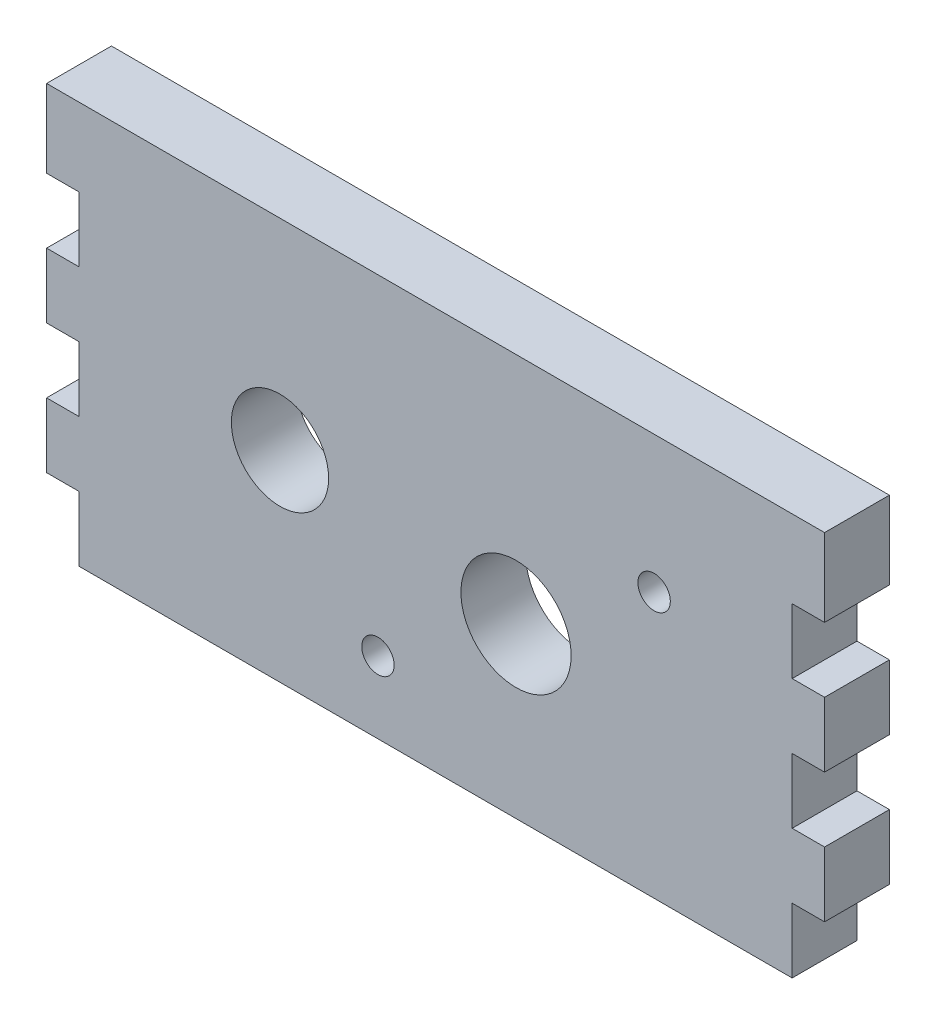
ISO-10303-21;
HEADER;
FILE_DESCRIPTION(('STEP AP214'),'2;1');
FILE_NAME('part.step','',(''),(''),'','','');
FILE_SCHEMA(('AUTOMOTIVE_DESIGN { 1 0 10303 214 1 1 1 1 }'));
ENDSEC;
DATA;
#1=APPLICATION_CONTEXT('core data for automotive mechanical design processes');
#2=APPLICATION_PROTOCOL_DEFINITION('international standard','automotive_design',2000,#1);
#3=PRODUCT_CONTEXT('',#1,'mechanical');
#4=PRODUCT('Part','Part','',(#3));
#5=PRODUCT_RELATED_PRODUCT_CATEGORY('part','',(#4));
#6=PRODUCT_DEFINITION_FORMATION('','',#4);
#7=PRODUCT_DEFINITION_CONTEXT('part definition',#1,'design');
#8=PRODUCT_DEFINITION('design','',#6,#7);
#9=PRODUCT_DEFINITION_SHAPE('','',#8);
#10=(LENGTH_UNIT() NAMED_UNIT(*) SI_UNIT(.MILLI.,.METRE.));
#11=(NAMED_UNIT(*) PLANE_ANGLE_UNIT() SI_UNIT($,.RADIAN.));
#12=(NAMED_UNIT(*) SI_UNIT($,.STERADIAN.) SOLID_ANGLE_UNIT());
#13=UNCERTAINTY_MEASURE_WITH_UNIT(LENGTH_MEASURE(1.E-05),#10,'distance_accuracy_value','');
#14=(GEOMETRIC_REPRESENTATION_CONTEXT(3) GLOBAL_UNCERTAINTY_ASSIGNED_CONTEXT((#13)) GLOBAL_UNIT_ASSIGNED_CONTEXT((#10,
#11,#12)) REPRESENTATION_CONTEXT('',''));
#15=CARTESIAN_POINT('',(0.,0.,0.));
#16=DIRECTION('',(0.,0.,1.));
#17=DIRECTION('',(1.,0.,0.));
#18=AXIS2_PLACEMENT_3D('',#15,#16,#17);
#19=CARTESIAN_POINT('',(0.,-31.,10.));
#20=DIRECTION('',(0.,1.,0.));
#21=DIRECTION('',(0.,0.,1.));
#22=AXIS2_PLACEMENT_3D('',#19,#20,#21);
#23=PLANE('',#22);
#24=DIRECTION('',(0.,0.,1.));
#25=VECTOR('',#24,1.);
#26=CARTESIAN_POINT('',(55.,-31.,-0.000999999999999265));
#27=LINE('',#26,#25);
#28=CARTESIAN_POINT('',(55.,-31.,0.));
#29=VERTEX_POINT('',#28);
#30=CARTESIAN_POINT('',(55.,-31.,10.));
#31=VERTEX_POINT('',#30);
#32=EDGE_CURVE('E205',#29,#31,#27,.T.);
#33=ORIENTED_EDGE('',*,*,#32,.T.);
#34=DIRECTION('',(1.,0.,0.));
#35=VECTOR('',#34,1.);
#36=CARTESIAN_POINT('',(0.,-31.,10.));
#37=LINE('',#36,#35);
#38=CARTESIAN_POINT('',(-55.,-31.,10.));
#39=VERTEX_POINT('',#38);
#40=EDGE_CURVE('E265',#39,#31,#37,.T.);
#41=ORIENTED_EDGE('',*,*,#40,.F.);
#42=DIRECTION('',(0.,0.,1.));
#43=VECTOR('',#42,1.);
#44=CARTESIAN_POINT('',(-55.,-31.,-0.000999999999999265));
#45=LINE('',#44,#43);
#46=CARTESIAN_POINT('',(-55.,-31.,0.));
#47=VERTEX_POINT('',#46);
#48=EDGE_CURVE('E281',#47,#39,#45,.T.);
#49=ORIENTED_EDGE('',*,*,#48,.F.);
#50=DIRECTION('',(1.,0.,0.));
#51=VECTOR('',#50,1.);
#52=CARTESIAN_POINT('',(0.,-31.,0.));
#53=LINE('',#52,#51);
#54=EDGE_CURVE('E230',#47,#29,#53,.T.);
#55=ORIENTED_EDGE('',*,*,#54,.T.);
#56=EDGE_LOOP('',(#33,#41,#49,#55));
#57=FACE_BOUND('',#56,.T.);
#58=ADVANCED_FACE('F37',(#57),#23,.F.);
#59=CARTESIAN_POINT('',(60.,0.,10.));
#60=DIRECTION('',(-1.,0.,0.));
#61=DIRECTION('',(0.,0.,1.));
#62=AXIS2_PLACEMENT_3D('',#59,#60,#61);
#63=PLANE('',#62);
#64=DIRECTION('',(0.,0.,1.));
#65=VECTOR('',#64,1.);
#66=CARTESIAN_POINT('',(60.,-21.,-0.000999999999999265));
#67=LINE('',#66,#65);
#68=CARTESIAN_POINT('',(60.,-21.,0.));
#69=VERTEX_POINT('',#68);
#70=CARTESIAN_POINT('',(60.,-21.,10.));
#71=VERTEX_POINT('',#70);
#72=EDGE_CURVE('E199',#69,#71,#67,.T.);
#73=ORIENTED_EDGE('',*,*,#72,.F.);
#74=DIRECTION('',(0.,1.,0.));
#75=VECTOR('',#74,1.);
#76=CARTESIAN_POINT('',(60.,0.,0.));
#77=LINE('',#76,#75);
#78=CARTESIAN_POINT('',(60.,-11.,0.));
#79=VERTEX_POINT('',#78);
#80=EDGE_CURVE('E212',#69,#79,#77,.T.);
#81=ORIENTED_EDGE('',*,*,#80,.T.);
#82=DIRECTION('',(0.,0.,1.));
#83=VECTOR('',#82,1.);
#84=CARTESIAN_POINT('',(60.,-11.,-0.000999999999999265));
#85=LINE('',#84,#83);
#86=CARTESIAN_POINT('',(60.,-11.,10.));
#87=VERTEX_POINT('',#86);
#88=EDGE_CURVE('E375',#79,#87,#85,.T.);
#89=ORIENTED_EDGE('',*,*,#88,.T.);
#90=DIRECTION('',(0.,1.,0.));
#91=VECTOR('',#90,1.);
#92=CARTESIAN_POINT('',(60.,0.,10.));
#93=LINE('',#92,#91);
#94=EDGE_CURVE('E214',#71,#87,#93,.T.);
#95=ORIENTED_EDGE('',*,*,#94,.F.);
#96=EDGE_LOOP('',(#73,#81,#89,#95));
#97=FACE_BOUND('',#96,.T.);
#98=ADVANCED_FACE('F210',(#97),#63,.F.);
#99=DIRECTION('',(0.,0.,1.));
#100=VECTOR('',#99,1.);
#101=CARTESIAN_POINT('',(60.,-1.,-0.000999999999999265));
#102=LINE('',#101,#100);
#103=CARTESIAN_POINT('',(60.,-1.,0.));
#104=VERTEX_POINT('',#103);
#105=CARTESIAN_POINT('',(60.,-1.,10.));
#106=VERTEX_POINT('',#105);
#107=EDGE_CURVE('E376',#104,#106,#102,.T.);
#108=ORIENTED_EDGE('',*,*,#107,.F.);
#109=CARTESIAN_POINT('',(60.,8.99999999999999,0.));
#110=VERTEX_POINT('',#109);
#111=EDGE_CURVE('E222',#104,#110,#77,.T.);
#112=ORIENTED_EDGE('',*,*,#111,.T.);
#113=DIRECTION('',(0.,0.,1.));
#114=VECTOR('',#113,1.);
#115=CARTESIAN_POINT('',(60.,8.99999999999999,-0.000999999999999265));
#116=LINE('',#115,#114);
#117=CARTESIAN_POINT('',(60.,8.99999999999999,10.));
#118=VERTEX_POINT('',#117);
#119=EDGE_CURVE('E347',#110,#118,#116,.T.);
#120=ORIENTED_EDGE('',*,*,#119,.T.);
#121=EDGE_CURVE('E264',#106,#118,#93,.T.);
#122=ORIENTED_EDGE('',*,*,#121,.F.);
#123=EDGE_LOOP('',(#108,#112,#120,#122));
#124=FACE_BOUND('',#123,.T.);
#125=ADVANCED_FACE('F451',(#124),#63,.F.);
#126=DIRECTION('',(0.,0.,1.));
#127=VECTOR('',#126,1.);
#128=CARTESIAN_POINT('',(60.,19.,-0.000999999999999265));
#129=LINE('',#128,#127);
#130=CARTESIAN_POINT('',(60.,19.,0.));
#131=VERTEX_POINT('',#130);
#132=CARTESIAN_POINT('',(60.,19.,10.));
#133=VERTEX_POINT('',#132);
#134=EDGE_CURVE('E348',#131,#133,#129,.T.);
#135=ORIENTED_EDGE('',*,*,#134,.F.);
#136=CARTESIAN_POINT('',(60.,31.,0.));
#137=VERTEX_POINT('',#136);
#138=EDGE_CURVE('E224',#131,#137,#77,.T.);
#139=ORIENTED_EDGE('',*,*,#138,.T.);
#140=DIRECTION('',(0.,0.,-1.));
#141=VECTOR('',#140,1.);
#142=CARTESIAN_POINT('',(60.,31.,10.));
#143=LINE('',#142,#141);
#144=CARTESIAN_POINT('',(60.,31.,10.));
#145=VERTEX_POINT('',#144);
#146=EDGE_CURVE('E11',#145,#137,#143,.T.);
#147=ORIENTED_EDGE('',*,*,#146,.F.);
#148=EDGE_CURVE('E262',#133,#145,#93,.T.);
#149=ORIENTED_EDGE('',*,*,#148,.F.);
#150=EDGE_LOOP('',(#135,#139,#147,#149));
#151=FACE_BOUND('',#150,.T.);
#152=ADVANCED_FACE('F435',(#151),#63,.F.);
#153=CARTESIAN_POINT('',(0.,0.,10.));
#154=DIRECTION('',(0.,0.,1.));
#155=DIRECTION('',(1.,0.,0.));
#156=AXIS2_PLACEMENT_3D('',#153,#154,#155);
#157=PLANE('',#156);
#158=CARTESIAN_POINT('',(-8.88967796851376,-19.9129873451272,10.));
#159=DIRECTION('',(0.,0.,1.));
#160=DIRECTION('',(1.,0.,0.));
#161=AXIS2_PLACEMENT_3D('',#158,#159,#160);
#162=CIRCLE('',#161,2.5);
#163=CARTESIAN_POINT('',(-6.38967796851376,-19.9129873451272,10.));
#164=VERTEX_POINT('',#163);
#165=EDGE_CURVE('E277',#164,#164,#162,.T.);
#166=ORIENTED_EDGE('',*,*,#165,.F.);
#167=EDGE_LOOP('',(#166));
#168=FACE_BOUND('',#167,.T.);
#169=CARTESIAN_POINT('',(33.7062283345138,9.91298734512723,10.));
#170=DIRECTION('',(0.,0.,1.));
#171=DIRECTION('',(1.,0.,0.));
#172=AXIS2_PLACEMENT_3D('',#169,#170,#171);
#173=CIRCLE('',#172,2.5);
#174=CARTESIAN_POINT('',(36.2062283345138,9.91298734512723,10.));
#175=VERTEX_POINT('',#174);
#176=EDGE_CURVE('E274',#175,#175,#173,.T.);
#177=ORIENTED_EDGE('',*,*,#176,.F.);
#178=EDGE_LOOP('',(#177));
#179=FACE_BOUND('',#178,.T.);
#180=CARTESIAN_POINT('',(-24.,0.,10.));
#181=DIRECTION('',(0.,0.,1.));
#182=DIRECTION('',(1.,0.,0.));
#183=AXIS2_PLACEMENT_3D('',#180,#181,#182);
#184=CIRCLE('',#183,7.5);
#185=CARTESIAN_POINT('',(-16.5,0.,10.));
#186=VERTEX_POINT('',#185);
#187=EDGE_CURVE('E271',#186,#186,#184,.T.);
#188=ORIENTED_EDGE('',*,*,#187,.F.);
#189=EDGE_LOOP('',(#188));
#190=FACE_BOUND('',#189,.T.);
#191=CARTESIAN_POINT('',(12.408275183,-5.,10.));
#192=DIRECTION('',(0.,0.,1.));
#193=DIRECTION('',(1.,0.,0.));
#194=AXIS2_PLACEMENT_3D('',#191,#192,#193);
#195=CIRCLE('',#194,8.5);
#196=CARTESIAN_POINT('',(20.908275183,-5.,10.));
#197=VERTEX_POINT('',#196);
#198=EDGE_CURVE('E268',#197,#197,#195,.T.);
#199=ORIENTED_EDGE('',*,*,#198,.F.);
#200=EDGE_LOOP('',(#199));
#201=FACE_BOUND('',#200,.T.);
#202=ORIENTED_EDGE('',*,*,#40,.T.);
#203=DIRECTION('',(0.,1.,0.));
#204=VECTOR('',#203,1.);
#205=CARTESIAN_POINT('',(55.,-21.,10.));
#206=LINE('',#205,#204);
#207=CARTESIAN_POINT('',(55.,-21.,10.));
#208=VERTEX_POINT('',#207);
#209=EDGE_CURVE('E215',#31,#208,#206,.T.);
#210=ORIENTED_EDGE('',*,*,#209,.T.);
#211=DIRECTION('',(1.,0.,0.));
#212=VECTOR('',#211,1.);
#213=CARTESIAN_POINT('',(60.,-21.,10.));
#214=LINE('',#213,#212);
#215=EDGE_CURVE('E397',#208,#71,#214,.T.);
#216=ORIENTED_EDGE('',*,*,#215,.T.);
#217=ORIENTED_EDGE('',*,*,#94,.T.);
#218=DIRECTION('',(-1.,0.,0.));
#219=VECTOR('',#218,1.);
#220=CARTESIAN_POINT('',(60.,-11.,10.));
#221=LINE('',#220,#219);
#222=CARTESIAN_POINT('',(55.,-11.,10.));
#223=VERTEX_POINT('',#222);
#224=EDGE_CURVE('E378',#87,#223,#221,.T.);
#225=ORIENTED_EDGE('',*,*,#224,.T.);
#226=DIRECTION('',(0.,1.,0.));
#227=VECTOR('',#226,1.);
#228=CARTESIAN_POINT('',(55.,-1.,10.));
#229=LINE('',#228,#227);
#230=CARTESIAN_POINT('',(55.,-1.,10.));
#231=VERTEX_POINT('',#230);
#232=EDGE_CURVE('E385',#223,#231,#229,.T.);
#233=ORIENTED_EDGE('',*,*,#232,.T.);
#234=DIRECTION('',(1.,0.,0.));
#235=VECTOR('',#234,1.);
#236=CARTESIAN_POINT('',(60.,-1.,10.));
#237=LINE('',#236,#235);
#238=EDGE_CURVE('E388',#231,#106,#237,.T.);
#239=ORIENTED_EDGE('',*,*,#238,.T.);
#240=ORIENTED_EDGE('',*,*,#121,.T.);
#241=DIRECTION('',(-1.,0.,0.));
#242=VECTOR('',#241,1.);
#243=CARTESIAN_POINT('',(60.,8.99999999999999,10.));
#244=LINE('',#243,#242);
#245=CARTESIAN_POINT('',(55.,8.99999999999999,10.));
#246=VERTEX_POINT('',#245);
#247=EDGE_CURVE('E351',#118,#246,#244,.T.);
#248=ORIENTED_EDGE('',*,*,#247,.T.);
#249=DIRECTION('',(0.,1.,0.));
#250=VECTOR('',#249,1.);
#251=CARTESIAN_POINT('',(55.,19.,10.));
#252=LINE('',#251,#250);
#253=CARTESIAN_POINT('',(55.,19.,10.));
#254=VERTEX_POINT('',#253);
#255=EDGE_CURVE('E359',#246,#254,#252,.T.);
#256=ORIENTED_EDGE('',*,*,#255,.T.);
#257=DIRECTION('',(1.,0.,0.));
#258=VECTOR('',#257,1.);
#259=CARTESIAN_POINT('',(60.,19.,10.));
#260=LINE('',#259,#258);
#261=EDGE_CURVE('E362',#254,#133,#260,.T.);
#262=ORIENTED_EDGE('',*,*,#261,.T.);
#263=ORIENTED_EDGE('',*,*,#148,.T.);
#264=DIRECTION('',(1.,0.,0.));
#265=VECTOR('',#264,1.);
#266=CARTESIAN_POINT('',(0.,31.,10.));
#267=LINE('',#266,#265);
#268=CARTESIAN_POINT('',(-60.,31.,10.));
#269=VERTEX_POINT('',#268);
#270=EDGE_CURVE('E259',#269,#145,#267,.T.);
#271=ORIENTED_EDGE('',*,*,#270,.F.);
#272=DIRECTION('',(0.,1.,0.));
#273=VECTOR('',#272,1.);
#274=CARTESIAN_POINT('',(-60.,0.,10.));
#275=LINE('',#274,#273);
#276=CARTESIAN_POINT('',(-60.,19.,10.));
#277=VERTEX_POINT('',#276);
#278=EDGE_CURVE('E258',#277,#269,#275,.T.);
#279=ORIENTED_EDGE('',*,*,#278,.F.);
#280=DIRECTION('',(-1.,0.,0.));
#281=VECTOR('',#280,1.);
#282=CARTESIAN_POINT('',(-60.,19.,10.));
#283=LINE('',#282,#281);
#284=CARTESIAN_POINT('',(-55.,19.,10.));
#285=VERTEX_POINT('',#284);
#286=EDGE_CURVE('E304',#285,#277,#283,.T.);
#287=ORIENTED_EDGE('',*,*,#286,.F.);
#288=DIRECTION('',(0.,1.,0.));
#289=VECTOR('',#288,1.);
#290=CARTESIAN_POINT('',(-55.,19.,10.));
#291=LINE('',#290,#289);
#292=CARTESIAN_POINT('',(-55.,8.99999999999999,10.));
#293=VERTEX_POINT('',#292);
#294=EDGE_CURVE('E311',#293,#285,#291,.T.);
#295=ORIENTED_EDGE('',*,*,#294,.F.);
#296=DIRECTION('',(1.,0.,0.));
#297=VECTOR('',#296,1.);
#298=CARTESIAN_POINT('',(-60.,8.99999999999999,10.));
#299=LINE('',#298,#297);
#300=CARTESIAN_POINT('',(-60.,8.99999999999999,10.));
#301=VERTEX_POINT('',#300);
#302=EDGE_CURVE('E314',#301,#293,#299,.T.);
#303=ORIENTED_EDGE('',*,*,#302,.F.);
#304=CARTESIAN_POINT('',(-60.,-1.,10.));
#305=VERTEX_POINT('',#304);
#306=EDGE_CURVE('E257',#305,#301,#275,.T.);
#307=ORIENTED_EDGE('',*,*,#306,.F.);
#308=DIRECTION('',(-1.,0.,0.));
#309=VECTOR('',#308,1.);
#310=CARTESIAN_POINT('',(-60.,-1.,10.));
#311=LINE('',#310,#309);
#312=CARTESIAN_POINT('',(-55.,-1.,10.));
#313=VERTEX_POINT('',#312);
#314=EDGE_CURVE('E326',#313,#305,#311,.T.);
#315=ORIENTED_EDGE('',*,*,#314,.F.);
#316=DIRECTION('',(0.,1.,0.));
#317=VECTOR('',#316,1.);
#318=CARTESIAN_POINT('',(-55.,-1.,10.));
#319=LINE('',#318,#317);
#320=CARTESIAN_POINT('',(-55.,-11.,10.));
#321=VERTEX_POINT('',#320);
#322=EDGE_CURVE('E333',#321,#313,#319,.T.);
#323=ORIENTED_EDGE('',*,*,#322,.F.);
#324=DIRECTION('',(1.,0.,0.));
#325=VECTOR('',#324,1.);
#326=CARTESIAN_POINT('',(-60.,-11.,10.));
#327=LINE('',#326,#325);
#328=CARTESIAN_POINT('',(-60.,-11.,10.));
#329=VERTEX_POINT('',#328);
#330=EDGE_CURVE('E336',#329,#321,#327,.T.);
#331=ORIENTED_EDGE('',*,*,#330,.F.);
#332=CARTESIAN_POINT('',(-60.,-21.,10.));
#333=VERTEX_POINT('',#332);
#334=EDGE_CURVE('E254',#333,#329,#275,.T.);
#335=ORIENTED_EDGE('',*,*,#334,.F.);
#336=DIRECTION('',(-1.,0.,0.));
#337=VECTOR('',#336,1.);
#338=CARTESIAN_POINT('',(-60.,-21.,10.));
#339=LINE('',#338,#337);
#340=CARTESIAN_POINT('',(-55.,-21.,10.));
#341=VERTEX_POINT('',#340);
#342=EDGE_CURVE('E284',#341,#333,#339,.T.);
#343=ORIENTED_EDGE('',*,*,#342,.F.);
#344=DIRECTION('',(0.,1.,0.));
#345=VECTOR('',#344,1.);
#346=CARTESIAN_POINT('',(-55.,-21.,10.));
#347=LINE('',#346,#345);
#348=EDGE_CURVE('E289',#39,#341,#347,.T.);
#349=ORIENTED_EDGE('',*,*,#348,.F.);
#350=EDGE_LOOP('',(#202,#210,#216,#217,#225,#233,#239,#240,#248,#256,#262,#263,#271,#279,#287,
#295,#303,#307,#315,#323,#331,#335,#343,#349));
#351=FACE_BOUND('',#350,.T.);
#352=ADVANCED_FACE('F405',(#168,#179,#190,#201,#351),#157,.T.);
#353=CARTESIAN_POINT('',(0.,0.,0.));
#354=DIRECTION('',(0.,0.,1.));
#355=DIRECTION('',(1.,0.,0.));
#356=AXIS2_PLACEMENT_3D('',#353,#354,#355);
#357=PLANE('',#356);
#358=CARTESIAN_POINT('',(12.408275183,-5.,0.));
#359=DIRECTION('',(0.,0.,1.));
#360=DIRECTION('',(1.,0.,0.));
#361=AXIS2_PLACEMENT_3D('',#358,#359,#360);
#362=CIRCLE('',#361,8.5);
#363=CARTESIAN_POINT('',(20.908275183,-5.,0.));
#364=VERTEX_POINT('',#363);
#365=EDGE_CURVE('E236',#364,#364,#362,.T.);
#366=ORIENTED_EDGE('',*,*,#365,.T.);
#367=EDGE_LOOP('',(#366));
#368=FACE_BOUND('',#367,.T.);
#369=CARTESIAN_POINT('',(-24.,0.,0.));
#370=DIRECTION('',(0.,0.,1.));
#371=DIRECTION('',(1.,0.,0.));
#372=AXIS2_PLACEMENT_3D('',#369,#370,#371);
#373=CIRCLE('',#372,7.5);
#374=CARTESIAN_POINT('',(-16.5,0.,0.));
#375=VERTEX_POINT('',#374);
#376=EDGE_CURVE('E242',#375,#375,#373,.T.);
#377=ORIENTED_EDGE('',*,*,#376,.T.);
#378=EDGE_LOOP('',(#377));
#379=FACE_BOUND('',#378,.T.);
#380=CARTESIAN_POINT('',(33.7062283345138,9.91298734512723,0.));
#381=DIRECTION('',(0.,0.,1.));
#382=DIRECTION('',(1.,0.,0.));
#383=AXIS2_PLACEMENT_3D('',#380,#381,#382);
#384=CIRCLE('',#383,2.5);
#385=CARTESIAN_POINT('',(36.2062283345138,9.91298734512723,0.));
#386=VERTEX_POINT('',#385);
#387=EDGE_CURVE('E247',#386,#386,#384,.T.);
#388=ORIENTED_EDGE('',*,*,#387,.T.);
#389=EDGE_LOOP('',(#388));
#390=FACE_BOUND('',#389,.T.);
#391=CARTESIAN_POINT('',(-8.88967796851376,-19.9129873451272,0.));
#392=DIRECTION('',(0.,0.,1.));
#393=DIRECTION('',(1.,0.,0.));
#394=AXIS2_PLACEMENT_3D('',#391,#392,#393);
#395=CIRCLE('',#394,2.5);
#396=CARTESIAN_POINT('',(-6.38967796851376,-19.9129873451272,0.));
#397=VERTEX_POINT('',#396);
#398=EDGE_CURVE('E250',#397,#397,#395,.T.);
#399=ORIENTED_EDGE('',*,*,#398,.T.);
#400=EDGE_LOOP('',(#399));
#401=FACE_BOUND('',#400,.T.);
#402=DIRECTION('',(0.,-1.,0.));
#403=VECTOR('',#402,1.);
#404=CARTESIAN_POINT('',(55.,-21.,0.));
#405=LINE('',#404,#403);
#406=CARTESIAN_POINT('',(55.,-21.,0.));
#407=VERTEX_POINT('',#406);
#408=EDGE_CURVE('E374',#407,#29,#405,.T.);
#409=ORIENTED_EDGE('',*,*,#408,.T.);
#410=ORIENTED_EDGE('',*,*,#54,.F.);
#411=DIRECTION('',(0.,-1.,0.));
#412=VECTOR('',#411,1.);
#413=CARTESIAN_POINT('',(-55.,-21.,0.));
#414=LINE('',#413,#412);
#415=CARTESIAN_POINT('',(-55.,-21.,0.));
#416=VERTEX_POINT('',#415);
#417=EDGE_CURVE('E294',#416,#47,#414,.T.);
#418=ORIENTED_EDGE('',*,*,#417,.F.);
#419=DIRECTION('',(1.,0.,0.));
#420=VECTOR('',#419,1.);
#421=CARTESIAN_POINT('',(-60.,-21.,0.));
#422=LINE('',#421,#420);
#423=CARTESIAN_POINT('',(-60.,-21.,0.));
#424=VERTEX_POINT('',#423);
#425=EDGE_CURVE('E292',#424,#416,#422,.T.);
#426=ORIENTED_EDGE('',*,*,#425,.F.);
#427=DIRECTION('',(0.,1.,0.));
#428=VECTOR('',#427,1.);
#429=CARTESIAN_POINT('',(-60.,0.,0.));
#430=LINE('',#429,#428);
#431=CARTESIAN_POINT('',(-60.,-11.,0.));
#432=VERTEX_POINT('',#431);
#433=EDGE_CURVE('E280',#424,#432,#430,.T.);
#434=ORIENTED_EDGE('',*,*,#433,.T.);
#435=DIRECTION('',(-1.,0.,0.));
#436=VECTOR('',#435,1.);
#437=CARTESIAN_POINT('',(-60.,-11.,0.));
#438=LINE('',#437,#436);
#439=CARTESIAN_POINT('',(-55.,-11.,0.));
#440=VERTEX_POINT('',#439);
#441=EDGE_CURVE('E296',#440,#432,#438,.T.);
#442=ORIENTED_EDGE('',*,*,#441,.F.);
#443=DIRECTION('',(0.,-1.,0.));
#444=VECTOR('',#443,1.);
#445=CARTESIAN_POINT('',(-55.,-1.,0.));
#446=LINE('',#445,#444);
#447=CARTESIAN_POINT('',(-55.,-1.,0.));
#448=VERTEX_POINT('',#447);
#449=EDGE_CURVE('E299',#448,#440,#446,.T.);
#450=ORIENTED_EDGE('',*,*,#449,.F.);
#451=DIRECTION('',(1.,0.,0.));
#452=VECTOR('',#451,1.);
#453=CARTESIAN_POINT('',(-60.,-1.,0.));
#454=LINE('',#453,#452);
#455=CARTESIAN_POINT('',(-60.,-1.,0.));
#456=VERTEX_POINT('',#455);
#457=EDGE_CURVE('E339',#456,#448,#454,.T.);
#458=ORIENTED_EDGE('',*,*,#457,.F.);
#459=CARTESIAN_POINT('',(-60.,8.99999999999999,0.));
#460=VERTEX_POINT('',#459);
#461=EDGE_CURVE('E419',#456,#460,#430,.T.);
#462=ORIENTED_EDGE('',*,*,#461,.T.);
#463=DIRECTION('',(-1.,0.,0.));
#464=VECTOR('',#463,1.);
#465=CARTESIAN_POINT('',(-60.,8.99999999999999,0.));
#466=LINE('',#465,#464);
#467=CARTESIAN_POINT('',(-55.,8.99999999999999,0.));
#468=VERTEX_POINT('',#467);
#469=EDGE_CURVE('E297',#468,#460,#466,.T.);
#470=ORIENTED_EDGE('',*,*,#469,.F.);
#471=DIRECTION('',(0.,-1.,0.));
#472=VECTOR('',#471,1.);
#473=CARTESIAN_POINT('',(-55.,19.,0.));
#474=LINE('',#473,#472);
#475=CARTESIAN_POINT('',(-55.,19.,0.));
#476=VERTEX_POINT('',#475);
#477=EDGE_CURVE('E204',#476,#468,#474,.T.);
#478=ORIENTED_EDGE('',*,*,#477,.F.);
#479=DIRECTION('',(1.,0.,0.));
#480=VECTOR('',#479,1.);
#481=CARTESIAN_POINT('',(-60.,19.,0.));
#482=LINE('',#481,#480);
#483=CARTESIAN_POINT('',(-60.,19.,0.));
#484=VERTEX_POINT('',#483);
#485=EDGE_CURVE('E317',#484,#476,#482,.T.);
#486=ORIENTED_EDGE('',*,*,#485,.F.);
#487=CARTESIAN_POINT('',(-60.,31.,0.));
#488=VERTEX_POINT('',#487);
#489=EDGE_CURVE('E226',#484,#488,#430,.T.);
#490=ORIENTED_EDGE('',*,*,#489,.T.);
#491=DIRECTION('',(1.,0.,0.));
#492=VECTOR('',#491,1.);
#493=CARTESIAN_POINT('',(0.,31.,0.));
#494=LINE('',#493,#492);
#495=EDGE_CURVE('E221',#488,#137,#494,.T.);
#496=ORIENTED_EDGE('',*,*,#495,.T.);
#497=ORIENTED_EDGE('',*,*,#138,.F.);
#498=DIRECTION('',(-1.,0.,0.));
#499=VECTOR('',#498,1.);
#500=CARTESIAN_POINT('',(60.,19.,0.));
#501=LINE('',#500,#499);
#502=CARTESIAN_POINT('',(55.,19.,0.));
#503=VERTEX_POINT('',#502);
#504=EDGE_CURVE('E343',#131,#503,#501,.T.);
#505=ORIENTED_EDGE('',*,*,#504,.T.);
#506=DIRECTION('',(0.,-1.,0.));
#507=VECTOR('',#506,1.);
#508=CARTESIAN_POINT('',(55.,19.,0.));
#509=LINE('',#508,#507);
#510=CARTESIAN_POINT('',(55.,8.99999999999999,0.));
#511=VERTEX_POINT('',#510);
#512=EDGE_CURVE('E368',#503,#511,#509,.T.);
#513=ORIENTED_EDGE('',*,*,#512,.T.);
#514=DIRECTION('',(1.,0.,0.));
#515=VECTOR('',#514,1.);
#516=CARTESIAN_POINT('',(60.,8.99999999999999,0.));
#517=LINE('',#516,#515);
#518=EDGE_CURVE('E365',#511,#110,#517,.T.);
#519=ORIENTED_EDGE('',*,*,#518,.T.);
#520=ORIENTED_EDGE('',*,*,#111,.F.);
#521=DIRECTION('',(-1.,0.,0.));
#522=VECTOR('',#521,1.);
#523=CARTESIAN_POINT('',(60.,-1.,0.));
#524=LINE('',#523,#522);
#525=CARTESIAN_POINT('',(55.,-1.,0.));
#526=VERTEX_POINT('',#525);
#527=EDGE_CURVE('E371',#104,#526,#524,.T.);
#528=ORIENTED_EDGE('',*,*,#527,.T.);
#529=DIRECTION('',(0.,-1.,0.));
#530=VECTOR('',#529,1.);
#531=CARTESIAN_POINT('',(55.,-1.,0.));
#532=LINE('',#531,#530);
#533=CARTESIAN_POINT('',(55.,-11.,0.));
#534=VERTEX_POINT('',#533);
#535=EDGE_CURVE('E346',#526,#534,#532,.T.);
#536=ORIENTED_EDGE('',*,*,#535,.T.);
#537=DIRECTION('',(1.,0.,0.));
#538=VECTOR('',#537,1.);
#539=CARTESIAN_POINT('',(60.,-11.,0.));
#540=LINE('',#539,#538);
#541=EDGE_CURVE('E220',#534,#79,#540,.T.);
#542=ORIENTED_EDGE('',*,*,#541,.T.);
#543=ORIENTED_EDGE('',*,*,#80,.F.);
#544=DIRECTION('',(-1.,0.,0.));
#545=VECTOR('',#544,1.);
#546=CARTESIAN_POINT('',(60.,-21.,0.));
#547=LINE('',#546,#545);
#548=EDGE_CURVE('E196',#69,#407,#547,.T.);
#549=ORIENTED_EDGE('',*,*,#548,.T.);
#550=EDGE_LOOP('',(#409,#410,#418,#426,#434,#442,#450,#458,#462,#470,#478,#486,#490,#496,#497,
#505,#513,#519,#520,#528,#536,#542,#543,#549));
#551=FACE_BOUND('',#550,.T.);
#552=ADVANCED_FACE('F218',(#368,#379,#390,#401,#551),#357,.F.);
#553=CARTESIAN_POINT('',(-60.,0.,10.));
#554=DIRECTION('',(-1.,0.,0.));
#555=DIRECTION('',(0.,0.,1.));
#556=AXIS2_PLACEMENT_3D('',#553,#554,#555);
#557=PLANE('',#556);
#558=DIRECTION('',(0.,0.,1.));
#559=VECTOR('',#558,1.);
#560=CARTESIAN_POINT('',(-60.,-1.,-0.000999999999999265));
#561=LINE('',#560,#559);
#562=EDGE_CURVE('E322',#456,#305,#561,.T.);
#563=ORIENTED_EDGE('',*,*,#562,.T.);
#564=ORIENTED_EDGE('',*,*,#306,.T.);
#565=DIRECTION('',(0.,0.,1.));
#566=VECTOR('',#565,1.);
#567=CARTESIAN_POINT('',(-60.,8.99999999999999,-0.000999999999999265));
#568=LINE('',#567,#566);
#569=EDGE_CURVE('E301',#460,#301,#568,.T.);
#570=ORIENTED_EDGE('',*,*,#569,.F.);
#571=ORIENTED_EDGE('',*,*,#461,.F.);
#572=EDGE_LOOP('',(#563,#564,#570,#571));
#573=FACE_BOUND('',#572,.T.);
#574=ADVANCED_FACE('F496',(#573),#557,.T.);
#575=DIRECTION('',(0.,0.,1.));
#576=VECTOR('',#575,1.);
#577=CARTESIAN_POINT('',(-60.,19.,-0.000999999999999265));
#578=LINE('',#577,#576);
#579=EDGE_CURVE('E300',#484,#277,#578,.T.);
#580=ORIENTED_EDGE('',*,*,#579,.T.);
#581=ORIENTED_EDGE('',*,*,#278,.T.);
#582=DIRECTION('',(0.,0.,-1.));
#583=VECTOR('',#582,1.);
#584=CARTESIAN_POINT('',(-60.,31.,10.));
#585=LINE('',#584,#583);
#586=EDGE_CURVE('E45',#269,#488,#585,.T.);
#587=ORIENTED_EDGE('',*,*,#586,.T.);
#588=ORIENTED_EDGE('',*,*,#489,.F.);
#589=EDGE_LOOP('',(#580,#581,#587,#588));
#590=FACE_BOUND('',#589,.T.);
#591=ADVANCED_FACE('F429',(#590),#557,.T.);
#592=CARTESIAN_POINT('',(0.,31.,10.));
#593=DIRECTION('',(0.,1.,0.));
#594=DIRECTION('',(0.,0.,1.));
#595=AXIS2_PLACEMENT_3D('',#592,#593,#594);
#596=PLANE('',#595);
#597=ORIENTED_EDGE('',*,*,#495,.F.);
#598=ORIENTED_EDGE('',*,*,#586,.F.);
#599=ORIENTED_EDGE('',*,*,#270,.T.);
#600=ORIENTED_EDGE('',*,*,#146,.T.);
#601=EDGE_LOOP('',(#597,#598,#599,#600));
#602=FACE_BOUND('',#601,.T.);
#603=ADVANCED_FACE('F433',(#602),#596,.T.);
#604=CARTESIAN_POINT('',(12.408275183,-5.,10.));
#605=DIRECTION('',(0.,0.,-1.));
#606=DIRECTION('',(-1.,0.,0.));
#607=AXIS2_PLACEMENT_3D('',#604,#605,#606);
#608=CYLINDRICAL_SURFACE('',#607,8.5);
#609=ORIENTED_EDGE('',*,*,#198,.T.);
#610=EDGE_LOOP('',(#609));
#611=FACE_BOUND('',#610,.T.);
#612=ORIENTED_EDGE('',*,*,#365,.F.);
#613=EDGE_LOOP('',(#612));
#614=FACE_BOUND('',#613,.T.);
#615=ADVANCED_FACE('F476',(#611,#614),#608,.F.);
#616=CARTESIAN_POINT('',(-24.,0.,10.));
#617=DIRECTION('',(0.,0.,-1.));
#618=DIRECTION('',(-1.,0.,0.));
#619=AXIS2_PLACEMENT_3D('',#616,#617,#618);
#620=CYLINDRICAL_SURFACE('',#619,7.5);
#621=ORIENTED_EDGE('',*,*,#187,.T.);
#622=EDGE_LOOP('',(#621));
#623=FACE_BOUND('',#622,.T.);
#624=ORIENTED_EDGE('',*,*,#376,.F.);
#625=EDGE_LOOP('',(#624));
#626=FACE_BOUND('',#625,.T.);
#627=ADVANCED_FACE('F479',(#623,#626),#620,.F.);
#628=CARTESIAN_POINT('',(33.7062283345138,9.91298734512723,10.));
#629=DIRECTION('',(0.,0.,-1.));
#630=DIRECTION('',(-1.,0.,0.));
#631=AXIS2_PLACEMENT_3D('',#628,#629,#630);
#632=CYLINDRICAL_SURFACE('',#631,2.5);
#633=ORIENTED_EDGE('',*,*,#176,.T.);
#634=EDGE_LOOP('',(#633));
#635=FACE_BOUND('',#634,.T.);
#636=ORIENTED_EDGE('',*,*,#387,.F.);
#637=EDGE_LOOP('',(#636));
#638=FACE_BOUND('',#637,.T.);
#639=ADVANCED_FACE('F482',(#635,#638),#632,.F.);
#640=CARTESIAN_POINT('',(-8.88967796851376,-19.9129873451272,10.));
#641=DIRECTION('',(0.,0.,-1.));
#642=DIRECTION('',(-1.,0.,0.));
#643=AXIS2_PLACEMENT_3D('',#640,#641,#642);
#644=CYLINDRICAL_SURFACE('',#643,2.5);
#645=ORIENTED_EDGE('',*,*,#165,.T.);
#646=EDGE_LOOP('',(#645));
#647=FACE_BOUND('',#646,.T.);
#648=ORIENTED_EDGE('',*,*,#398,.F.);
#649=EDGE_LOOP('',(#648));
#650=FACE_BOUND('',#649,.T.);
#651=ADVANCED_FACE('F39',(#647,#650),#644,.F.);
#652=DIRECTION('',(0.,0.,1.));
#653=VECTOR('',#652,1.);
#654=CARTESIAN_POINT('',(-60.,-11.,-0.000999999999999265));
#655=LINE('',#654,#653);
#656=EDGE_CURVE('E323',#432,#329,#655,.T.);
#657=ORIENTED_EDGE('',*,*,#656,.F.);
#658=ORIENTED_EDGE('',*,*,#433,.F.);
#659=DIRECTION('',(0.,0.,1.));
#660=VECTOR('',#659,1.);
#661=CARTESIAN_POINT('',(-60.,-21.,-0.000999999999999265));
#662=LINE('',#661,#660);
#663=EDGE_CURVE('E253',#424,#333,#662,.T.);
#664=ORIENTED_EDGE('',*,*,#663,.T.);
#665=ORIENTED_EDGE('',*,*,#334,.T.);
#666=EDGE_LOOP('',(#657,#658,#664,#665));
#667=FACE_BOUND('',#666,.T.);
#668=ADVANCED_FACE('F418',(#667),#557,.T.);
#669=CARTESIAN_POINT('',(-60.,-21.,-0.000999999999999265));
#670=DIRECTION('',(0.,1.,0.));
#671=DIRECTION('',(0.,0.,1.));
#672=AXIS2_PLACEMENT_3D('',#669,#670,#671);
#673=PLANE('',#672);
#674=ORIENTED_EDGE('',*,*,#425,.T.);
#675=DIRECTION('',(0.,0.,1.));
#676=VECTOR('',#675,1.);
#677=CARTESIAN_POINT('',(-55.,-21.,-0.000999999999999265));
#678=LINE('',#677,#676);
#679=EDGE_CURVE('E283',#416,#341,#678,.T.);
#680=ORIENTED_EDGE('',*,*,#679,.T.);
#681=ORIENTED_EDGE('',*,*,#342,.T.);
#682=ORIENTED_EDGE('',*,*,#663,.F.);
#683=EDGE_LOOP('',(#674,#680,#681,#682));
#684=FACE_BOUND('',#683,.T.);
#685=ADVANCED_FACE('F512',(#684),#673,.F.);
#686=CARTESIAN_POINT('',(-55.,-21.,-0.000999999999999265));
#687=DIRECTION('',(1.,0.,0.));
#688=DIRECTION('',(0.,0.,-1.));
#689=AXIS2_PLACEMENT_3D('',#686,#687,#688);
#690=PLANE('',#689);
#691=ORIENTED_EDGE('',*,*,#417,.T.);
#692=ORIENTED_EDGE('',*,*,#48,.T.);
#693=ORIENTED_EDGE('',*,*,#348,.T.);
#694=ORIENTED_EDGE('',*,*,#679,.F.);
#695=EDGE_LOOP('',(#691,#692,#693,#694));
#696=FACE_BOUND('',#695,.T.);
#697=ADVANCED_FACE('F410',(#696),#690,.F.);
#698=CARTESIAN_POINT('',(-60.,19.,-0.000999999999999265));
#699=DIRECTION('',(0.,1.,0.));
#700=DIRECTION('',(0.,0.,1.));
#701=AXIS2_PLACEMENT_3D('',#698,#699,#700);
#702=PLANE('',#701);
#703=ORIENTED_EDGE('',*,*,#485,.T.);
#704=DIRECTION('',(0.,0.,1.));
#705=VECTOR('',#704,1.);
#706=CARTESIAN_POINT('',(-55.,19.,-0.000999999999999265));
#707=LINE('',#706,#705);
#708=EDGE_CURVE('E306',#476,#285,#707,.T.);
#709=ORIENTED_EDGE('',*,*,#708,.T.);
#710=ORIENTED_EDGE('',*,*,#286,.T.);
#711=ORIENTED_EDGE('',*,*,#579,.F.);
#712=EDGE_LOOP('',(#703,#709,#710,#711));
#713=FACE_BOUND('',#712,.T.);
#714=ADVANCED_FACE('F534',(#713),#702,.F.);
#715=CARTESIAN_POINT('',(-55.,19.,-0.000999999999999265));
#716=DIRECTION('',(1.,0.,0.));
#717=DIRECTION('',(0.,0.,-1.));
#718=AXIS2_PLACEMENT_3D('',#715,#716,#717);
#719=PLANE('',#718);
#720=ORIENTED_EDGE('',*,*,#477,.T.);
#721=DIRECTION('',(0.,0.,1.));
#722=VECTOR('',#721,1.);
#723=CARTESIAN_POINT('',(-55.,8.99999999999999,-0.000999999999999265));
#724=LINE('',#723,#722);
#725=EDGE_CURVE('E303',#468,#293,#724,.T.);
#726=ORIENTED_EDGE('',*,*,#725,.T.);
#727=ORIENTED_EDGE('',*,*,#294,.T.);
#728=ORIENTED_EDGE('',*,*,#708,.F.);
#729=EDGE_LOOP('',(#720,#726,#727,#728));
#730=FACE_BOUND('',#729,.T.);
#731=ADVANCED_FACE('F580',(#730),#719,.F.);
#732=CARTESIAN_POINT('',(-60.,8.99999999999999,-0.000999999999999265));
#733=DIRECTION('',(0.,-1.,0.));
#734=DIRECTION('',(0.,0.,-1.));
#735=AXIS2_PLACEMENT_3D('',#732,#733,#734);
#736=PLANE('',#735);
#737=ORIENTED_EDGE('',*,*,#469,.T.);
#738=ORIENTED_EDGE('',*,*,#569,.T.);
#739=ORIENTED_EDGE('',*,*,#302,.T.);
#740=ORIENTED_EDGE('',*,*,#725,.F.);
#741=EDGE_LOOP('',(#737,#738,#739,#740));
#742=FACE_BOUND('',#741,.T.);
#743=ADVANCED_FACE('F590',(#742),#736,.F.);
#744=CARTESIAN_POINT('',(-60.,-1.,-0.000999999999999265));
#745=DIRECTION('',(0.,1.,0.));
#746=DIRECTION('',(0.,0.,1.));
#747=AXIS2_PLACEMENT_3D('',#744,#745,#746);
#748=PLANE('',#747);
#749=ORIENTED_EDGE('',*,*,#457,.T.);
#750=DIRECTION('',(0.,0.,1.));
#751=VECTOR('',#750,1.);
#752=CARTESIAN_POINT('',(-55.,-1.,-0.000999999999999265));
#753=LINE('',#752,#751);
#754=EDGE_CURVE('E328',#448,#313,#753,.T.);
#755=ORIENTED_EDGE('',*,*,#754,.T.);
#756=ORIENTED_EDGE('',*,*,#314,.T.);
#757=ORIENTED_EDGE('',*,*,#562,.F.);
#758=EDGE_LOOP('',(#749,#755,#756,#757));
#759=FACE_BOUND('',#758,.T.);
#760=ADVANCED_FACE('F600',(#759),#748,.F.);
#761=CARTESIAN_POINT('',(-55.,-1.,-0.000999999999999265));
#762=DIRECTION('',(1.,0.,0.));
#763=DIRECTION('',(0.,0.,-1.));
#764=AXIS2_PLACEMENT_3D('',#761,#762,#763);
#765=PLANE('',#764);
#766=ORIENTED_EDGE('',*,*,#449,.T.);
#767=DIRECTION('',(0.,0.,1.));
#768=VECTOR('',#767,1.);
#769=CARTESIAN_POINT('',(-55.,-11.,-0.000999999999999265));
#770=LINE('',#769,#768);
#771=EDGE_CURVE('E325',#440,#321,#770,.T.);
#772=ORIENTED_EDGE('',*,*,#771,.T.);
#773=ORIENTED_EDGE('',*,*,#322,.T.);
#774=ORIENTED_EDGE('',*,*,#754,.F.);
#775=EDGE_LOOP('',(#766,#772,#773,#774));
#776=FACE_BOUND('',#775,.T.);
#777=ADVANCED_FACE('F610',(#776),#765,.F.);
#778=CARTESIAN_POINT('',(-60.,-11.,-0.000999999999999265));
#779=DIRECTION('',(0.,-1.,0.));
#780=DIRECTION('',(0.,0.,-1.));
#781=AXIS2_PLACEMENT_3D('',#778,#779,#780);
#782=PLANE('',#781);
#783=ORIENTED_EDGE('',*,*,#441,.T.);
#784=ORIENTED_EDGE('',*,*,#656,.T.);
#785=ORIENTED_EDGE('',*,*,#330,.T.);
#786=ORIENTED_EDGE('',*,*,#771,.F.);
#787=EDGE_LOOP('',(#783,#784,#785,#786));
#788=FACE_BOUND('',#787,.T.);
#789=ADVANCED_FACE('F620',(#788),#782,.F.);
#790=CARTESIAN_POINT('',(60.,8.99999999999999,-0.000999999999999265));
#791=DIRECTION('',(0.,1.,0.));
#792=DIRECTION('',(0.,0.,1.));
#793=AXIS2_PLACEMENT_3D('',#790,#791,#792);
#794=PLANE('',#793);
#795=DIRECTION('',(0.,0.,1.));
#796=VECTOR('',#795,1.);
#797=CARTESIAN_POINT('',(55.,8.99999999999999,-0.000999999999999265));
#798=LINE('',#797,#796);
#799=EDGE_CURVE('E353',#511,#246,#798,.T.);
#800=ORIENTED_EDGE('',*,*,#799,.T.);
#801=ORIENTED_EDGE('',*,*,#247,.F.);
#802=ORIENTED_EDGE('',*,*,#119,.F.);
#803=ORIENTED_EDGE('',*,*,#518,.F.);
#804=EDGE_LOOP('',(#800,#801,#802,#803));
#805=FACE_BOUND('',#804,.T.);
#806=ADVANCED_FACE('F446',(#805),#794,.T.);
#807=CARTESIAN_POINT('',(55.,19.,-0.000999999999999265));
#808=DIRECTION('',(1.,0.,0.));
#809=DIRECTION('',(0.,0.,-1.));
#810=AXIS2_PLACEMENT_3D('',#807,#808,#809);
#811=PLANE('',#810);
#812=DIRECTION('',(0.,0.,1.));
#813=VECTOR('',#812,1.);
#814=CARTESIAN_POINT('',(55.,19.,-0.000999999999999265));
#815=LINE('',#814,#813);
#816=EDGE_CURVE('E350',#503,#254,#815,.T.);
#817=ORIENTED_EDGE('',*,*,#816,.T.);
#818=ORIENTED_EDGE('',*,*,#255,.F.);
#819=ORIENTED_EDGE('',*,*,#799,.F.);
#820=ORIENTED_EDGE('',*,*,#512,.F.);
#821=EDGE_LOOP('',(#817,#818,#819,#820));
#822=FACE_BOUND('',#821,.T.);
#823=ADVANCED_FACE('F444',(#822),#811,.T.);
#824=CARTESIAN_POINT('',(60.,19.,-0.000999999999999265));
#825=DIRECTION('',(0.,-1.,0.));
#826=DIRECTION('',(0.,0.,-1.));
#827=AXIS2_PLACEMENT_3D('',#824,#825,#826);
#828=PLANE('',#827);
#829=ORIENTED_EDGE('',*,*,#134,.T.);
#830=ORIENTED_EDGE('',*,*,#261,.F.);
#831=ORIENTED_EDGE('',*,*,#816,.F.);
#832=ORIENTED_EDGE('',*,*,#504,.F.);
#833=EDGE_LOOP('',(#829,#830,#831,#832));
#834=FACE_BOUND('',#833,.T.);
#835=ADVANCED_FACE('F439',(#834),#828,.T.);
#836=CARTESIAN_POINT('',(60.,-11.,-0.000999999999999265));
#837=DIRECTION('',(0.,1.,0.));
#838=DIRECTION('',(0.,0.,1.));
#839=AXIS2_PLACEMENT_3D('',#836,#837,#838);
#840=PLANE('',#839);
#841=DIRECTION('',(0.,0.,1.));
#842=VECTOR('',#841,1.);
#843=CARTESIAN_POINT('',(55.,-11.,-0.000999999999999265));
#844=LINE('',#843,#842);
#845=EDGE_CURVE('E380',#534,#223,#844,.T.);
#846=ORIENTED_EDGE('',*,*,#845,.T.);
#847=ORIENTED_EDGE('',*,*,#224,.F.);
#848=ORIENTED_EDGE('',*,*,#88,.F.);
#849=ORIENTED_EDGE('',*,*,#541,.F.);
#850=EDGE_LOOP('',(#846,#847,#848,#849));
#851=FACE_BOUND('',#850,.T.);
#852=ADVANCED_FACE('F454',(#851),#840,.T.);
#853=CARTESIAN_POINT('',(55.,-1.,-0.000999999999999265));
#854=DIRECTION('',(1.,0.,0.));
#855=DIRECTION('',(0.,0.,-1.));
#856=AXIS2_PLACEMENT_3D('',#853,#854,#855);
#857=PLANE('',#856);
#858=DIRECTION('',(0.,0.,1.));
#859=VECTOR('',#858,1.);
#860=CARTESIAN_POINT('',(55.,-1.,-0.000999999999999265));
#861=LINE('',#860,#859);
#862=EDGE_CURVE('E60',#526,#231,#861,.T.);
#863=ORIENTED_EDGE('',*,*,#862,.T.);
#864=ORIENTED_EDGE('',*,*,#232,.F.);
#865=ORIENTED_EDGE('',*,*,#845,.F.);
#866=ORIENTED_EDGE('',*,*,#535,.F.);
#867=EDGE_LOOP('',(#863,#864,#865,#866));
#868=FACE_BOUND('',#867,.T.);
#869=ADVANCED_FACE('F457',(#868),#857,.T.);
#870=CARTESIAN_POINT('',(60.,-1.,-0.000999999999999265));
#871=DIRECTION('',(0.,-1.,0.));
#872=DIRECTION('',(0.,0.,-1.));
#873=AXIS2_PLACEMENT_3D('',#870,#871,#872);
#874=PLANE('',#873);
#875=ORIENTED_EDGE('',*,*,#107,.T.);
#876=ORIENTED_EDGE('',*,*,#238,.F.);
#877=ORIENTED_EDGE('',*,*,#862,.F.);
#878=ORIENTED_EDGE('',*,*,#527,.F.);
#879=EDGE_LOOP('',(#875,#876,#877,#878));
#880=FACE_BOUND('',#879,.T.);
#881=ADVANCED_FACE('F458',(#880),#874,.T.);
#882=CARTESIAN_POINT('',(55.,-21.,-0.000999999999999265));
#883=DIRECTION('',(1.,0.,0.));
#884=DIRECTION('',(0.,0.,-1.));
#885=AXIS2_PLACEMENT_3D('',#882,#883,#884);
#886=PLANE('',#885);
#887=DIRECTION('',(0.,0.,1.));
#888=VECTOR('',#887,1.);
#889=CARTESIAN_POINT('',(55.,-21.,-0.000999999999999265));
#890=LINE('',#889,#888);
#891=EDGE_CURVE('E52',#407,#208,#890,.T.);
#892=ORIENTED_EDGE('',*,*,#891,.T.);
#893=ORIENTED_EDGE('',*,*,#209,.F.);
#894=ORIENTED_EDGE('',*,*,#32,.F.);
#895=ORIENTED_EDGE('',*,*,#408,.F.);
#896=EDGE_LOOP('',(#892,#893,#894,#895));
#897=FACE_BOUND('',#896,.T.);
#898=ADVANCED_FACE('F401',(#897),#886,.T.);
#899=CARTESIAN_POINT('',(60.,-21.,-0.000999999999999265));
#900=DIRECTION('',(0.,-1.,0.));
#901=DIRECTION('',(0.,0.,-1.));
#902=AXIS2_PLACEMENT_3D('',#899,#900,#901);
#903=PLANE('',#902);
#904=ORIENTED_EDGE('',*,*,#72,.T.);
#905=ORIENTED_EDGE('',*,*,#215,.F.);
#906=ORIENTED_EDGE('',*,*,#891,.F.);
#907=ORIENTED_EDGE('',*,*,#548,.F.);
#908=EDGE_LOOP('',(#904,#905,#906,#907));
#909=FACE_BOUND('',#908,.T.);
#910=ADVANCED_FACE('F198',(#909),#903,.T.);
#911=CLOSED_SHELL('',(#58,#98,#125,#152,#352,#552,#574,#591,#603,#615,#627,#639,#651,#668,#685,
#697,#714,#731,#743,#760,#777,#789,#806,#823,#835,#852,#869,#881,#898,#910));
#912=MANIFOLD_SOLID_BREP('B2',#911);
#913=ADVANCED_BREP_SHAPE_REPRESENTATION('',(#18,#912),#14);
#914=SHAPE_DEFINITION_REPRESENTATION(#9,#913);
ENDSEC;
END-ISO-10303-21;
